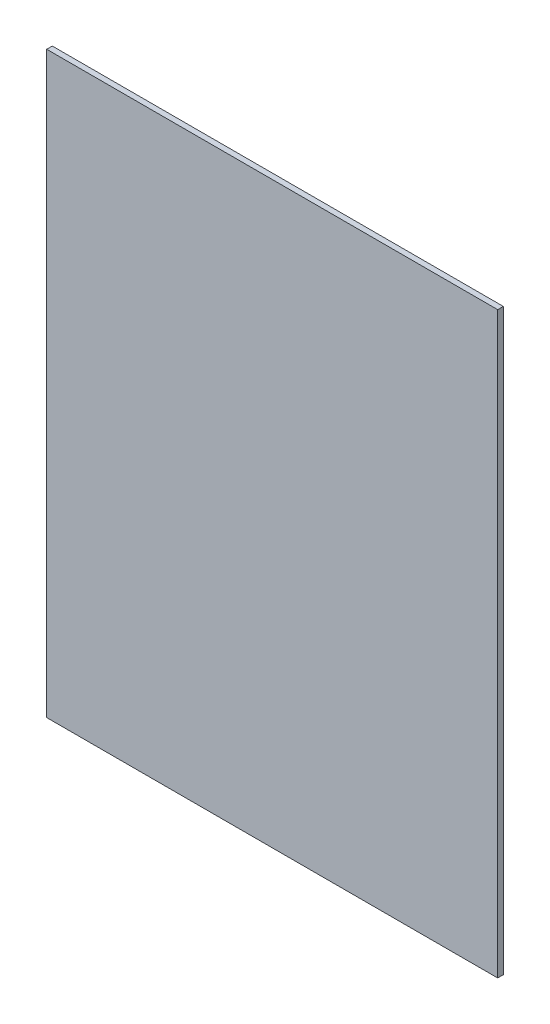
ISO-10303-21;
HEADER;
FILE_DESCRIPTION(('STEP AP214'),'2;1');
FILE_NAME('part.step','',(''),(''),'','','');
FILE_SCHEMA(('AUTOMOTIVE_DESIGN { 1 0 10303 214 1 1 1 1 }'));
ENDSEC;
DATA;
#1=APPLICATION_CONTEXT('core data for automotive mechanical design processes');
#2=APPLICATION_PROTOCOL_DEFINITION('international standard','automotive_design',2000,#1);
#3=PRODUCT_CONTEXT('',#1,'mechanical');
#4=PRODUCT('Part','Part','',(#3));
#5=PRODUCT_RELATED_PRODUCT_CATEGORY('part','',(#4));
#6=PRODUCT_DEFINITION_FORMATION('','',#4);
#7=PRODUCT_DEFINITION_CONTEXT('part definition',#1,'design');
#8=PRODUCT_DEFINITION('design','',#6,#7);
#9=PRODUCT_DEFINITION_SHAPE('','',#8);
#10=(LENGTH_UNIT() NAMED_UNIT(*) SI_UNIT(.MILLI.,.METRE.));
#11=(NAMED_UNIT(*) PLANE_ANGLE_UNIT() SI_UNIT($,.RADIAN.));
#12=(NAMED_UNIT(*) SI_UNIT($,.STERADIAN.) SOLID_ANGLE_UNIT());
#13=UNCERTAINTY_MEASURE_WITH_UNIT(LENGTH_MEASURE(1.E-05),#10,'distance_accuracy_value','');
#14=(GEOMETRIC_REPRESENTATION_CONTEXT(3) GLOBAL_UNCERTAINTY_ASSIGNED_CONTEXT((#13)) GLOBAL_UNIT_ASSIGNED_CONTEXT((#10,
#11,#12)) REPRESENTATION_CONTEXT('',''));
#15=CARTESIAN_POINT('',(0.,0.,0.));
#16=DIRECTION('',(0.,0.,1.));
#17=DIRECTION('',(1.,0.,0.));
#18=AXIS2_PLACEMENT_3D('',#15,#16,#17);
#19=CARTESIAN_POINT('',(-240.,-65.2533491308973,-121.285023565587));
#20=DIRECTION('',(1.,0.,0.));
#21=DIRECTION('',(0.,0.,-1.));
#22=AXIS2_PLACEMENT_3D('',#19,#20,#21);
#23=PLANE('',#22);
#24=DIRECTION('',(0.,0.,-1.));
#25=VECTOR('',#24,1.);
#26=CARTESIAN_POINT('',(-240.,410.,268.2));
#27=LINE('',#26,#25);
#28=CARTESIAN_POINT('',(-240.,410.,268.2));
#29=VERTEX_POINT('',#28);
#30=CARTESIAN_POINT('',(-240.,410.,265.));
#31=VERTEX_POINT('',#30);
#32=EDGE_CURVE('E101',#29,#31,#27,.T.);
#33=ORIENTED_EDGE('',*,*,#32,.T.);
#34=DIRECTION('',(0.,-1.,0.));
#35=VECTOR('',#34,1.);
#36=CARTESIAN_POINT('',(-240.,450.,265.));
#37=LINE('',#36,#35);
#38=CARTESIAN_POINT('',(-240.,80.,265.));
#39=VERTEX_POINT('',#38);
#40=EDGE_CURVE('E41',#31,#39,#37,.T.);
#41=ORIENTED_EDGE('',*,*,#40,.T.);
#42=DIRECTION('',(0.,0.,1.));
#43=VECTOR('',#42,1.);
#44=CARTESIAN_POINT('',(-240.,80.,268.2));
#45=LINE('',#44,#43);
#46=CARTESIAN_POINT('',(-240.,80.,268.2));
#47=VERTEX_POINT('',#46);
#48=EDGE_CURVE('E93',#39,#47,#45,.T.);
#49=ORIENTED_EDGE('',*,*,#48,.T.);
#50=DIRECTION('',(0.,-1.,0.));
#51=VECTOR('',#50,1.);
#52=CARTESIAN_POINT('',(-240.,450.,268.2));
#53=LINE('',#52,#51);
#54=EDGE_CURVE('E62',#29,#47,#53,.T.);
#55=ORIENTED_EDGE('',*,*,#54,.F.);
#56=EDGE_LOOP('',(#33,#41,#49,#55));
#57=FACE_BOUND('',#56,.T.);
#58=ADVANCED_FACE('F37',(#57),#23,.F.);
#59=CARTESIAN_POINT('',(17.1516731332455,511.627538889502,-121.285023565587));
#60=DIRECTION('',(-1.,0.,0.));
#61=DIRECTION('',(0.,-1.,0.));
#62=AXIS2_PLACEMENT_3D('',#59,#60,#61);
#63=PLANE('',#62);
#64=DIRECTION('',(0.,0.,1.));
#65=VECTOR('',#64,1.);
#66=CARTESIAN_POINT('',(17.1516731332454,410.,268.2));
#67=LINE('',#66,#65);
#68=CARTESIAN_POINT('',(17.1516731332454,410.,265.));
#69=VERTEX_POINT('',#68);
#70=CARTESIAN_POINT('',(17.1516731332454,410.,268.2));
#71=VERTEX_POINT('',#70);
#72=EDGE_CURVE('E103',#69,#71,#67,.T.);
#73=ORIENTED_EDGE('',*,*,#72,.T.);
#74=DIRECTION('',(0.,1.,0.));
#75=VECTOR('',#74,1.);
#76=CARTESIAN_POINT('',(17.1516731332454,450.,268.2));
#77=LINE('',#76,#75);
#78=CARTESIAN_POINT('',(17.1516731332454,80.,268.2));
#79=VERTEX_POINT('',#78);
#80=EDGE_CURVE('E92',#79,#71,#77,.T.);
#81=ORIENTED_EDGE('',*,*,#80,.F.);
#82=DIRECTION('',(0.,0.,-1.));
#83=VECTOR('',#82,1.);
#84=CARTESIAN_POINT('',(17.1516731332455,80.,268.2));
#85=LINE('',#84,#83);
#86=CARTESIAN_POINT('',(17.1516731332454,80.,265.));
#87=VERTEX_POINT('',#86);
#88=EDGE_CURVE('E54',#79,#87,#85,.T.);
#89=ORIENTED_EDGE('',*,*,#88,.T.);
#90=DIRECTION('',(0.,1.,0.));
#91=VECTOR('',#90,1.);
#92=CARTESIAN_POINT('',(17.1516731332454,450.,265.));
#93=LINE('',#92,#91);
#94=EDGE_CURVE('E83',#87,#69,#93,.T.);
#95=ORIENTED_EDGE('',*,*,#94,.T.);
#96=EDGE_LOOP('',(#73,#81,#89,#95));
#97=FACE_BOUND('',#96,.T.);
#98=ADVANCED_FACE('F91',(#97),#63,.F.);
#99=CARTESIAN_POINT('',(250.,80.,268.2));
#100=DIRECTION('',(0.,-1.,0.));
#101=DIRECTION('',(1.,0.,0.));
#102=AXIS2_PLACEMENT_3D('',#99,#100,#101);
#103=PLANE('',#102);
#104=ORIENTED_EDGE('',*,*,#48,.F.);
#105=DIRECTION('',(-1.,0.,0.));
#106=VECTOR('',#105,1.);
#107=CARTESIAN_POINT('',(-250.,80.,265.));
#108=LINE('',#107,#106);
#109=EDGE_CURVE('E84',#87,#39,#108,.T.);
#110=ORIENTED_EDGE('',*,*,#109,.F.);
#111=ORIENTED_EDGE('',*,*,#88,.F.);
#112=DIRECTION('',(-1.,0.,0.));
#113=VECTOR('',#112,1.);
#114=CARTESIAN_POINT('',(-250.,80.,268.2));
#115=LINE('',#114,#113);
#116=EDGE_CURVE('E46',#79,#47,#115,.T.);
#117=ORIENTED_EDGE('',*,*,#116,.T.);
#118=EDGE_LOOP('',(#104,#110,#111,#117));
#119=FACE_BOUND('',#118,.T.);
#120=ADVANCED_FACE('F95',(#119),#103,.T.);
#121=CARTESIAN_POINT('',(250.,410.,268.2));
#122=DIRECTION('',(0.,1.,0.));
#123=DIRECTION('',(-1.,0.,0.));
#124=AXIS2_PLACEMENT_3D('',#121,#122,#123);
#125=PLANE('',#124);
#126=ORIENTED_EDGE('',*,*,#32,.F.);
#127=DIRECTION('',(1.,0.,0.));
#128=VECTOR('',#127,1.);
#129=CARTESIAN_POINT('',(-250.,410.,268.2));
#130=LINE('',#129,#128);
#131=EDGE_CURVE('E11',#29,#71,#130,.T.);
#132=ORIENTED_EDGE('',*,*,#131,.T.);
#133=ORIENTED_EDGE('',*,*,#72,.F.);
#134=DIRECTION('',(1.,0.,0.));
#135=VECTOR('',#134,1.);
#136=CARTESIAN_POINT('',(-250.,410.,265.));
#137=LINE('',#136,#135);
#138=EDGE_CURVE('E86',#31,#69,#137,.T.);
#139=ORIENTED_EDGE('',*,*,#138,.F.);
#140=EDGE_LOOP('',(#126,#132,#133,#139));
#141=FACE_BOUND('',#140,.T.);
#142=ADVANCED_FACE('F111',(#141),#125,.T.);
#143=CARTESIAN_POINT('',(-250.,450.,268.2));
#144=DIRECTION('',(0.,0.,-1.));
#145=DIRECTION('',(-1.,0.,0.));
#146=AXIS2_PLACEMENT_3D('',#143,#144,#145);
#147=PLANE('',#146);
#148=ORIENTED_EDGE('',*,*,#131,.F.);
#149=ORIENTED_EDGE('',*,*,#54,.T.);
#150=ORIENTED_EDGE('',*,*,#116,.F.);
#151=ORIENTED_EDGE('',*,*,#80,.T.);
#152=EDGE_LOOP('',(#148,#149,#150,#151));
#153=FACE_BOUND('',#152,.T.);
#154=ADVANCED_FACE('F108',(#153),#147,.F.);
#155=CARTESIAN_POINT('',(-250.,450.,265.));
#156=DIRECTION('',(0.,0.,-1.));
#157=DIRECTION('',(-1.,0.,0.));
#158=AXIS2_PLACEMENT_3D('',#155,#156,#157);
#159=PLANE('',#158);
#160=ORIENTED_EDGE('',*,*,#40,.F.);
#161=ORIENTED_EDGE('',*,*,#138,.T.);
#162=ORIENTED_EDGE('',*,*,#94,.F.);
#163=ORIENTED_EDGE('',*,*,#109,.T.);
#164=EDGE_LOOP('',(#160,#161,#162,#163));
#165=FACE_BOUND('',#164,.T.);
#166=ADVANCED_FACE('F39',(#165),#159,.T.);
#167=CLOSED_SHELL('',(#58,#98,#120,#142,#154,#166));
#168=MANIFOLD_SOLID_BREP('B2',#167);
#169=ADVANCED_BREP_SHAPE_REPRESENTATION('',(#18,#168),#14);
#170=SHAPE_DEFINITION_REPRESENTATION(#9,#169);
ENDSEC;
END-ISO-10303-21;
